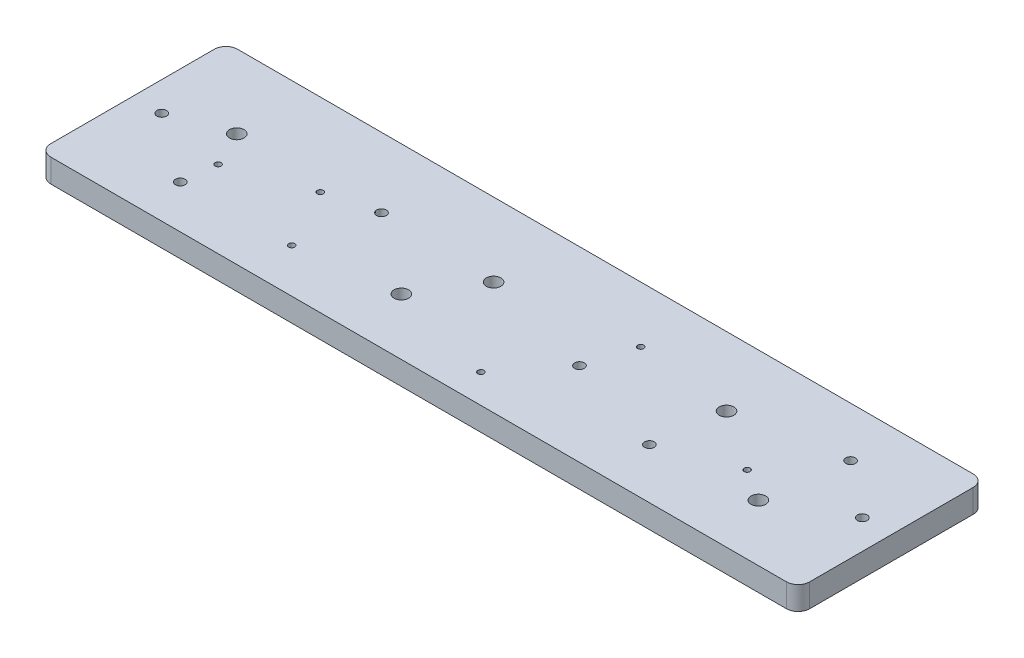
ISO-10303-21;
HEADER;
FILE_DESCRIPTION(('STEP AP214'),'2;1');
FILE_NAME('part.step','',(''),(''),'','','');
FILE_SCHEMA(('AUTOMOTIVE_DESIGN { 1 0 10303 214 1 1 1 1 }'));
ENDSEC;
DATA;
#1=APPLICATION_CONTEXT('core data for automotive mechanical design processes');
#2=APPLICATION_PROTOCOL_DEFINITION('international standard','automotive_design',2000,#1);
#3=PRODUCT_CONTEXT('',#1,'mechanical');
#4=PRODUCT('Part','Part','',(#3));
#5=PRODUCT_RELATED_PRODUCT_CATEGORY('part','',(#4));
#6=PRODUCT_DEFINITION_FORMATION('','',#4);
#7=PRODUCT_DEFINITION_CONTEXT('part definition',#1,'design');
#8=PRODUCT_DEFINITION('design','',#6,#7);
#9=PRODUCT_DEFINITION_SHAPE('','',#8);
#10=(LENGTH_UNIT() NAMED_UNIT(*) SI_UNIT(.MILLI.,.METRE.));
#11=(NAMED_UNIT(*) PLANE_ANGLE_UNIT() SI_UNIT($,.RADIAN.));
#12=(NAMED_UNIT(*) SI_UNIT($,.STERADIAN.) SOLID_ANGLE_UNIT());
#13=UNCERTAINTY_MEASURE_WITH_UNIT(LENGTH_MEASURE(1.E-05),#10,'distance_accuracy_value','');
#14=(GEOMETRIC_REPRESENTATION_CONTEXT(3) GLOBAL_UNCERTAINTY_ASSIGNED_CONTEXT((#13)) GLOBAL_UNIT_ASSIGNED_CONTEXT((#10,
#11,#12)) REPRESENTATION_CONTEXT('',''));
#15=CARTESIAN_POINT('',(0.,0.,0.));
#16=DIRECTION('',(0.,0.,1.));
#17=DIRECTION('',(1.,0.,0.));
#18=AXIS2_PLACEMENT_3D('',#15,#16,#17);
#19=CARTESIAN_POINT('',(0.,0.,0.));
#20=DIRECTION('',(0.,-1.,0.));
#21=DIRECTION('',(0.,0.,-1.));
#22=AXIS2_PLACEMENT_3D('',#19,#20,#21);
#23=PLANE('',#22);
#24=CARTESIAN_POINT('',(25.,0.,-80.));
#25=DIRECTION('',(0.,1.,0.));
#26=DIRECTION('',(0.,0.,1.));
#27=AXIS2_PLACEMENT_3D('',#24,#25,#26);
#28=CIRCLE('',#27,4.2);
#29=CARTESIAN_POINT('',(25.,0.,-75.8));
#30=VERTEX_POINT('',#29);
#31=EDGE_CURVE('E337',#30,#30,#28,.T.);
#32=ORIENTED_EDGE('',*,*,#31,.T.);
#33=EDGE_LOOP('',(#32));
#34=FACE_BOUND('',#33,.T.);
#35=CARTESIAN_POINT('',(625.,0.,-80.));
#36=DIRECTION('',(0.,1.,0.));
#37=DIRECTION('',(0.,0.,1.));
#38=AXIS2_PLACEMENT_3D('',#35,#36,#37);
#39=CIRCLE('',#38,4.19999999999998);
#40=CARTESIAN_POINT('',(625.,0.,-75.8));
#41=VERTEX_POINT('',#40);
#42=EDGE_CURVE('E329',#41,#41,#39,.T.);
#43=ORIENTED_EDGE('',*,*,#42,.T.);
#44=EDGE_LOOP('',(#43));
#45=FACE_BOUND('',#44,.T.);
#46=CARTESIAN_POINT('',(178.587076189916,0.,-37.6529586931211));
#47=DIRECTION('',(0.,1.,0.));
#48=DIRECTION('',(0.,0.,1.));
#49=AXIS2_PLACEMENT_3D('',#46,#47,#48);
#50=CIRCLE('',#49,2.59999999999999);
#51=CARTESIAN_POINT('',(178.587076189916,0.,-35.0529586931211));
#52=VERTEX_POINT('',#51);
#53=EDGE_CURVE('E321',#52,#52,#50,.T.);
#54=ORIENTED_EDGE('',*,*,#53,.T.);
#55=EDGE_LOOP('',(#54));
#56=FACE_BOUND('',#55,.T.);
#57=CARTESIAN_POINT('',(151.347462457807,0.,-89.4082247841275));
#58=DIRECTION('',(0.,1.,0.));
#59=DIRECTION('',(0.,0.,1.));
#60=AXIS2_PLACEMENT_3D('',#57,#58,#59);
#61=CIRCLE('',#60,2.59999999999999);
#62=CARTESIAN_POINT('',(151.347462457807,0.,-86.8082247841275));
#63=VERTEX_POINT('',#62);
#64=EDGE_CURVE('E313',#63,#63,#61,.T.);
#65=ORIENTED_EDGE('',*,*,#64,.T.);
#66=EDGE_LOOP('',(#65));
#67=FACE_BOUND('',#66,.T.);
#68=CARTESIAN_POINT('',(353.601594418714,0.,-24.7141421703694));
#69=DIRECTION('',(0.,1.,0.));
#70=DIRECTION('',(0.,0.,1.));
#71=AXIS2_PLACEMENT_3D('',#68,#69,#70);
#72=CIRCLE('',#71,2.59999999999999);
#73=CARTESIAN_POINT('',(353.601594418714,0.,-22.1141421703694));
#74=VERTEX_POINT('',#73);
#75=EDGE_CURVE('E305',#74,#74,#72,.T.);
#76=ORIENTED_EDGE('',*,*,#75,.T.);
#77=EDGE_LOOP('',(#76));
#78=FACE_BOUND('',#77,.T.);
#79=CARTESIAN_POINT('',(403.313889479812,0.,-111.880906113117));
#80=DIRECTION('',(0.,1.,0.));
#81=DIRECTION('',(0.,0.,1.));
#82=AXIS2_PLACEMENT_3D('',#79,#80,#81);
#83=CIRCLE('',#82,2.59999999999999);
#84=CARTESIAN_POINT('',(403.313889479812,0.,-109.280906113117));
#85=VERTEX_POINT('',#84);
#86=EDGE_CURVE('E297',#85,#85,#83,.T.);
#87=ORIENTED_EDGE('',*,*,#86,.T.);
#88=EDGE_LOOP('',(#87));
#89=FACE_BOUND('',#88,.T.);
#90=CARTESIAN_POINT('',(540.192948483658,0.,-66.2545531118351));
#91=DIRECTION('',(0.,1.,0.));
#92=DIRECTION('',(0.,0.,1.));
#93=AXIS2_PLACEMENT_3D('',#90,#91,#92);
#94=CIRCLE('',#93,2.60000000000005);
#95=CARTESIAN_POINT('',(540.192948483658,0.,-63.6545531118351));
#96=VERTEX_POINT('',#95);
#97=EDGE_CURVE('E289',#96,#96,#94,.T.);
#98=ORIENTED_EDGE('',*,*,#97,.T.);
#99=EDGE_LOOP('',(#98));
#100=FACE_BOUND('',#99,.T.);
#101=CARTESIAN_POINT('',(87.0078360424779,0.,-66.2545531118351));
#102=DIRECTION('',(0.,1.,0.));
#103=DIRECTION('',(0.,0.,1.));
#104=AXIS2_PLACEMENT_3D('',#101,#102,#103);
#105=CIRCLE('',#104,2.59999999999999);
#106=CARTESIAN_POINT('',(87.0078360424779,0.,-63.6545531118351));
#107=VERTEX_POINT('',#106);
#108=EDGE_CURVE('E281',#107,#107,#105,.T.);
#109=ORIENTED_EDGE('',*,*,#108,.T.);
#110=EDGE_LOOP('',(#109));
#111=FACE_BOUND('',#110,.T.);
#112=CARTESIAN_POINT('',(192.887873399273,0.,-100.304070276971));
#113=DIRECTION('',(0.,1.,0.));
#114=DIRECTION('',(0.,0.,1.));
#115=AXIS2_PLACEMENT_3D('',#112,#113,#114);
#116=CIRCLE('',#115,4.14999999999999);
#117=CARTESIAN_POINT('',(192.887873399273,0.,-96.154070276971));
#118=VERTEX_POINT('',#117);
#119=EDGE_CURVE('E273',#118,#118,#116,.T.);
#120=ORIENTED_EDGE('',*,*,#119,.T.);
#121=EDGE_LOOP('',(#120));
#122=FACE_BOUND('',#121,.T.);
#123=CARTESIAN_POINT('',(83.9294184708383,0.,-36.9719683498184));
#124=DIRECTION('',(0.,1.,0.));
#125=DIRECTION('',(0.,0.,1.));
#126=AXIS2_PLACEMENT_3D('',#123,#124,#125);
#127=CIRCLE('',#126,4.15);
#128=CARTESIAN_POINT('',(83.9294184708383,0.,-32.8219683498184));
#129=VERTEX_POINT('',#128);
#130=EDGE_CURVE('E265',#129,#129,#127,.T.);
#131=ORIENTED_EDGE('',*,*,#130,.T.);
#132=EDGE_LOOP('',(#131));
#133=FACE_BOUND('',#132,.T.);
#134=CARTESIAN_POINT('',(391.056063300363,0.,-71.7024758582569));
#135=DIRECTION('',(0.,1.,0.));
#136=DIRECTION('',(0.,0.,1.));
#137=AXIS2_PLACEMENT_3D('',#134,#135,#136);
#138=CIRCLE('',#137,4.14999999999999);
#139=CARTESIAN_POINT('',(391.056063300363,0.,-67.5524758582569));
#140=VERTEX_POINT('',#139);
#141=EDGE_CURVE('E257',#140,#140,#138,.T.);
#142=ORIENTED_EDGE('',*,*,#141,.T.);
#143=EDGE_LOOP('',(#142));
#144=FACE_BOUND('',#143,.T.);
#145=CARTESIAN_POINT('',(577.647417365308,0.,-117.328828859539));
#146=DIRECTION('',(0.,1.,0.));
#147=DIRECTION('',(0.,0.,1.));
#148=AXIS2_PLACEMENT_3D('',#145,#146,#147);
#149=CIRCLE('',#148,4.14999999999999);
#150=CARTESIAN_POINT('',(577.647417365308,0.,-113.178828859539));
#151=VERTEX_POINT('',#150);
#152=EDGE_CURVE('E249',#151,#151,#149,.T.);
#153=ORIENTED_EDGE('',*,*,#152,.T.);
#154=EDGE_LOOP('',(#153));
#155=FACE_BOUND('',#154,.T.);
#156=DIRECTION('',(0.,0.,-1.));
#157=VECTOR('',#156,1.);
#158=CARTESIAN_POINT('',(0.,0.,0.));
#159=LINE('',#158,#157);
#160=CARTESIAN_POINT('',(0.,0.,-10.));
#161=VERTEX_POINT('',#160);
#162=CARTESIAN_POINT('',(0.,0.,-150.));
#163=VERTEX_POINT('',#162);
#164=EDGE_CURVE('E114',#161,#163,#159,.T.);
#165=ORIENTED_EDGE('',*,*,#164,.T.);
#166=CARTESIAN_POINT('',(10.,0.,-150.));
#167=DIRECTION('',(0.,-1.,0.));
#168=DIRECTION('',(0.,0.,-1.));
#169=AXIS2_PLACEMENT_3D('',#166,#167,#168);
#170=CIRCLE('',#169,10.);
#171=CARTESIAN_POINT('',(10.,0.,-160.));
#172=VERTEX_POINT('',#171);
#173=EDGE_CURVE('E122',#163,#172,#170,.T.);
#174=ORIENTED_EDGE('',*,*,#173,.T.);
#175=DIRECTION('',(1.,0.,0.));
#176=VECTOR('',#175,1.);
#177=CARTESIAN_POINT('',(0.,0.,-160.));
#178=LINE('',#177,#176);
#179=CARTESIAN_POINT('',(640.,0.,-160.));
#180=VERTEX_POINT('',#179);
#181=EDGE_CURVE('E134',#172,#180,#178,.T.);
#182=ORIENTED_EDGE('',*,*,#181,.T.);
#183=CARTESIAN_POINT('',(640.,0.,-150.));
#184=DIRECTION('',(0.,-1.,0.));
#185=DIRECTION('',(0.,0.,-1.));
#186=AXIS2_PLACEMENT_3D('',#183,#184,#185);
#187=CIRCLE('',#186,10.);
#188=CARTESIAN_POINT('',(650.,0.,-150.));
#189=VERTEX_POINT('',#188);
#190=EDGE_CURVE('E123',#180,#189,#187,.T.);
#191=ORIENTED_EDGE('',*,*,#190,.T.);
#192=DIRECTION('',(0.,0.,-1.));
#193=VECTOR('',#192,1.);
#194=CARTESIAN_POINT('',(650.,0.,0.));
#195=LINE('',#194,#193);
#196=CARTESIAN_POINT('',(650.,0.,-10.));
#197=VERTEX_POINT('',#196);
#198=EDGE_CURVE('E185',#197,#189,#195,.T.);
#199=ORIENTED_EDGE('',*,*,#198,.F.);
#200=CARTESIAN_POINT('',(640.,0.,-10.));
#201=DIRECTION('',(0.,-1.,0.));
#202=DIRECTION('',(0.,0.,-1.));
#203=AXIS2_PLACEMENT_3D('',#200,#201,#202);
#204=CIRCLE('',#203,10.);
#205=CARTESIAN_POINT('',(640.,0.,0.));
#206=VERTEX_POINT('',#205);
#207=EDGE_CURVE('E145',#197,#206,#204,.T.);
#208=ORIENTED_EDGE('',*,*,#207,.T.);
#209=DIRECTION('',(1.,0.,0.));
#210=VECTOR('',#209,1.);
#211=CARTESIAN_POINT('',(0.,0.,0.));
#212=LINE('',#211,#210);
#213=CARTESIAN_POINT('',(10.,0.,0.));
#214=VERTEX_POINT('',#213);
#215=EDGE_CURVE('E116',#214,#206,#212,.T.);
#216=ORIENTED_EDGE('',*,*,#215,.F.);
#217=CARTESIAN_POINT('',(10.,0.,-10.));
#218=DIRECTION('',(0.,-1.,0.));
#219=DIRECTION('',(0.,0.,-1.));
#220=AXIS2_PLACEMENT_3D('',#217,#218,#219);
#221=CIRCLE('',#220,10.);
#222=EDGE_CURVE('E111',#214,#161,#221,.T.);
#223=ORIENTED_EDGE('',*,*,#222,.T.);
#224=EDGE_LOOP('',(#165,#174,#182,#191,#199,#208,#216,#223));
#225=FACE_BOUND('',#224,.T.);
#226=CARTESIAN_POINT('',(292.31246352147,0.,-96.8991185604573));
#227=DIRECTION('',(0.,1.,0.));
#228=DIRECTION('',(0.,0.,1.));
#229=AXIS2_PLACEMENT_3D('',#226,#227,#228);
#230=CIRCLE('',#229,6.24999999999998);
#231=CARTESIAN_POINT('',(292.31246352147,0.,-90.6491185604574));
#232=VERTEX_POINT('',#231);
#233=EDGE_CURVE('E135',#232,#232,#230,.T.);
#234=ORIENTED_EDGE('',*,*,#233,.T.);
#235=EDGE_LOOP('',(#234));
#236=FACE_BOUND('',#235,.T.);
#237=CARTESIAN_POINT('',(567.432562215767,0.,-48.5488041859645));
#238=DIRECTION('',(0.,1.,0.));
#239=DIRECTION('',(0.,0.,1.));
#240=AXIS2_PLACEMENT_3D('',#237,#238,#239);
#241=CIRCLE('',#240,6.24999999999998);
#242=CARTESIAN_POINT('',(567.432562215767,0.,-42.2988041859645));
#243=VERTEX_POINT('',#242);
#244=EDGE_CURVE('E209',#243,#243,#241,.T.);
#245=ORIENTED_EDGE('',*,*,#244,.T.);
#246=EDGE_LOOP('',(#245));
#247=FACE_BOUND('',#246,.T.);
#248=CARTESIAN_POINT('',(487.756692049349,0.,-100.985060620274));
#249=DIRECTION('',(0.,1.,0.));
#250=DIRECTION('',(0.,0.,1.));
#251=AXIS2_PLACEMENT_3D('',#248,#249,#250);
#252=CIRCLE('',#251,6.24999999999998);
#253=CARTESIAN_POINT('',(487.756692049349,0.,-94.7350606202737));
#254=VERTEX_POINT('',#253);
#255=EDGE_CURVE('E217',#254,#254,#252,.T.);
#256=ORIENTED_EDGE('',*,*,#255,.T.);
#257=EDGE_LOOP('',(#256));
#258=FACE_BOUND('',#257,.T.);
#259=CARTESIAN_POINT('',(261.667898072847,0.,-48.5488041859645));
#260=DIRECTION('',(0.,1.,0.));
#261=DIRECTION('',(0.,0.,1.));
#262=AXIS2_PLACEMENT_3D('',#259,#260,#261);
#263=CIRCLE('',#262,6.24999999999998);
#264=CARTESIAN_POINT('',(261.667898072847,0.,-42.2988041859645));
#265=VERTEX_POINT('',#264);
#266=EDGE_CURVE('E225',#265,#265,#263,.T.);
#267=ORIENTED_EDGE('',*,*,#266,.T.);
#268=EDGE_LOOP('',(#267));
#269=FACE_BOUND('',#268,.T.);
#270=CARTESIAN_POINT('',(72.3525826346922,0.,-96.8991185604573));
#271=DIRECTION('',(0.,1.,0.));
#272=DIRECTION('',(0.,0.,1.));
#273=AXIS2_PLACEMENT_3D('',#270,#271,#272);
#274=CIRCLE('',#273,6.24999999999999);
#275=CARTESIAN_POINT('',(72.3525826346922,0.,-90.6491185604574));
#276=VERTEX_POINT('',#275);
#277=EDGE_CURVE('E233',#276,#276,#274,.T.);
#278=ORIENTED_EDGE('',*,*,#277,.T.);
#279=EDGE_LOOP('',(#278));
#280=FACE_BOUND('',#279,.T.);
#281=CARTESIAN_POINT('',(479.584807929716,0.,-43.1008814395428));
#282=DIRECTION('',(0.,1.,0.));
#283=DIRECTION('',(0.,0.,1.));
#284=AXIS2_PLACEMENT_3D('',#281,#282,#283);
#285=CIRCLE('',#284,4.14999999999999);
#286=CARTESIAN_POINT('',(479.584807929716,0.,-38.9508814395428));
#287=VERTEX_POINT('',#286);
#288=EDGE_CURVE('E241',#287,#287,#285,.T.);
#289=ORIENTED_EDGE('',*,*,#288,.T.);
#290=EDGE_LOOP('',(#289));
#291=FACE_BOUND('',#290,.T.);
#292=ADVANCED_FACE('F45',(#34,#45,#56,#67,#78,#89,#100,#111,#122,#133,#144,#155,#225,#236,#247,
#258,#269,#280,#291),#23,.T.);
#293=CARTESIAN_POINT('',(0.,20.,0.));
#294=DIRECTION('',(-1.,0.,0.));
#295=DIRECTION('',(0.,0.,1.));
#296=AXIS2_PLACEMENT_3D('',#293,#294,#295);
#297=PLANE('',#296);
#298=DIRECTION('',(0.,0.,-1.));
#299=VECTOR('',#298,1.);
#300=CARTESIAN_POINT('',(0.,20.,0.));
#301=LINE('',#300,#299);
#302=CARTESIAN_POINT('',(0.,20.,-10.));
#303=VERTEX_POINT('',#302);
#304=CARTESIAN_POINT('',(0.,20.,-150.));
#305=VERTEX_POINT('',#304);
#306=EDGE_CURVE('E191',#303,#305,#301,.T.);
#307=ORIENTED_EDGE('',*,*,#306,.T.);
#308=DIRECTION('',(0.,-1.,0.));
#309=VECTOR('',#308,1.);
#310=CARTESIAN_POINT('',(0.,20.,-150.));
#311=LINE('',#310,#309);
#312=EDGE_CURVE('E132',#305,#163,#311,.T.);
#313=ORIENTED_EDGE('',*,*,#312,.T.);
#314=ORIENTED_EDGE('',*,*,#164,.F.);
#315=DIRECTION('',(0.,-1.,0.));
#316=VECTOR('',#315,1.);
#317=CARTESIAN_POINT('',(0.,20.,-10.));
#318=LINE('',#317,#316);
#319=EDGE_CURVE('E129',#161,#303,#318,.F.);
#320=ORIENTED_EDGE('',*,*,#319,.T.);
#321=EDGE_LOOP('',(#307,#313,#314,#320));
#322=FACE_BOUND('',#321,.T.);
#323=ADVANCED_FACE('F128',(#322),#297,.T.);
#324=CARTESIAN_POINT('',(0.,20.,0.));
#325=DIRECTION('',(0.,0.,-1.));
#326=DIRECTION('',(-1.,0.,0.));
#327=AXIS2_PLACEMENT_3D('',#324,#325,#326);
#328=PLANE('',#327);
#329=DIRECTION('',(1.,0.,0.));
#330=VECTOR('',#329,1.);
#331=CARTESIAN_POINT('',(0.,20.,0.));
#332=LINE('',#331,#330);
#333=CARTESIAN_POINT('',(10.,20.,0.));
#334=VERTEX_POINT('',#333);
#335=CARTESIAN_POINT('',(640.,20.,0.));
#336=VERTEX_POINT('',#335);
#337=EDGE_CURVE('E141',#334,#336,#332,.T.);
#338=ORIENTED_EDGE('',*,*,#337,.F.);
#339=DIRECTION('',(0.,-1.,0.));
#340=VECTOR('',#339,1.);
#341=CARTESIAN_POINT('',(10.,0.,0.));
#342=LINE('',#341,#340);
#343=EDGE_CURVE('E178',#334,#214,#342,.T.);
#344=ORIENTED_EDGE('',*,*,#343,.T.);
#345=ORIENTED_EDGE('',*,*,#215,.T.);
#346=DIRECTION('',(0.,-1.,0.));
#347=VECTOR('',#346,1.);
#348=CARTESIAN_POINT('',(640.,20.,0.));
#349=LINE('',#348,#347);
#350=EDGE_CURVE('E175',#206,#336,#349,.F.);
#351=ORIENTED_EDGE('',*,*,#350,.T.);
#352=EDGE_LOOP('',(#338,#344,#345,#351));
#353=FACE_BOUND('',#352,.T.);
#354=ADVANCED_FACE('F411',(#353),#328,.F.);
#355=CARTESIAN_POINT('',(650.,20.,0.));
#356=DIRECTION('',(-1.,0.,0.));
#357=DIRECTION('',(0.,0.,1.));
#358=AXIS2_PLACEMENT_3D('',#355,#356,#357);
#359=PLANE('',#358);
#360=ORIENTED_EDGE('',*,*,#198,.T.);
#361=DIRECTION('',(0.,-1.,0.));
#362=VECTOR('',#361,1.);
#363=CARTESIAN_POINT('',(650.,20.,-150.));
#364=LINE('',#363,#362);
#365=CARTESIAN_POINT('',(650.,20.,-150.));
#366=VERTEX_POINT('',#365);
#367=EDGE_CURVE('E11',#189,#366,#364,.F.);
#368=ORIENTED_EDGE('',*,*,#367,.T.);
#369=DIRECTION('',(0.,0.,-1.));
#370=VECTOR('',#369,1.);
#371=CARTESIAN_POINT('',(650.,20.,0.));
#372=LINE('',#371,#370);
#373=CARTESIAN_POINT('',(650.,20.,-10.));
#374=VERTEX_POINT('',#373);
#375=EDGE_CURVE('E147',#374,#366,#372,.T.);
#376=ORIENTED_EDGE('',*,*,#375,.F.);
#377=DIRECTION('',(0.,-1.,0.));
#378=VECTOR('',#377,1.);
#379=CARTESIAN_POINT('',(650.,20.,-10.));
#380=LINE('',#379,#378);
#381=EDGE_CURVE('E54',#374,#197,#380,.T.);
#382=ORIENTED_EDGE('',*,*,#381,.T.);
#383=EDGE_LOOP('',(#360,#368,#376,#382));
#384=FACE_BOUND('',#383,.T.);
#385=ADVANCED_FACE('F184',(#384),#359,.F.);
#386=CARTESIAN_POINT('',(0.,20.,-160.));
#387=DIRECTION('',(0.,0.,-1.));
#388=DIRECTION('',(-1.,0.,0.));
#389=AXIS2_PLACEMENT_3D('',#386,#387,#388);
#390=PLANE('',#389);
#391=ORIENTED_EDGE('',*,*,#181,.F.);
#392=DIRECTION('',(0.,-1.,0.));
#393=VECTOR('',#392,1.);
#394=CARTESIAN_POINT('',(10.,20.,-160.));
#395=LINE('',#394,#393);
#396=CARTESIAN_POINT('',(10.,20.,-160.));
#397=VERTEX_POINT('',#396);
#398=EDGE_CURVE('E162',#172,#397,#395,.F.);
#399=ORIENTED_EDGE('',*,*,#398,.T.);
#400=DIRECTION('',(1.,0.,0.));
#401=VECTOR('',#400,1.);
#402=CARTESIAN_POINT('',(0.,20.,-160.));
#403=LINE('',#402,#401);
#404=CARTESIAN_POINT('',(640.,20.,-160.));
#405=VERTEX_POINT('',#404);
#406=EDGE_CURVE('E196',#397,#405,#403,.T.);
#407=ORIENTED_EDGE('',*,*,#406,.T.);
#408=DIRECTION('',(0.,-1.,0.));
#409=VECTOR('',#408,1.);
#410=CARTESIAN_POINT('',(640.,0.,-160.));
#411=LINE('',#410,#409);
#412=EDGE_CURVE('E158',#405,#180,#411,.T.);
#413=ORIENTED_EDGE('',*,*,#412,.T.);
#414=EDGE_LOOP('',(#391,#399,#407,#413));
#415=FACE_BOUND('',#414,.T.);
#416=ADVANCED_FACE('F352',(#415),#390,.T.);
#417=CARTESIAN_POINT('',(0.,20.,0.));
#418=DIRECTION('',(0.,-1.,0.));
#419=DIRECTION('',(0.,0.,-1.));
#420=AXIS2_PLACEMENT_3D('',#417,#418,#419);
#421=PLANE('',#420);
#422=CARTESIAN_POINT('',(25.,20.,-80.));
#423=DIRECTION('',(0.,1.,0.));
#424=DIRECTION('',(0.,0.,1.));
#425=AXIS2_PLACEMENT_3D('',#422,#423,#424);
#426=CIRCLE('',#425,4.2);
#427=CARTESIAN_POINT('',(25.,20.,-75.8));
#428=VERTEX_POINT('',#427);
#429=EDGE_CURVE('E341',#428,#428,#426,.T.);
#430=ORIENTED_EDGE('',*,*,#429,.F.);
#431=EDGE_LOOP('',(#430));
#432=FACE_BOUND('',#431,.T.);
#433=CARTESIAN_POINT('',(625.,20.,-80.));
#434=DIRECTION('',(0.,1.,0.));
#435=DIRECTION('',(0.,0.,1.));
#436=AXIS2_PLACEMENT_3D('',#433,#434,#435);
#437=CIRCLE('',#436,4.19999999999998);
#438=CARTESIAN_POINT('',(625.,20.,-75.8));
#439=VERTEX_POINT('',#438);
#440=EDGE_CURVE('E333',#439,#439,#437,.T.);
#441=ORIENTED_EDGE('',*,*,#440,.F.);
#442=EDGE_LOOP('',(#441));
#443=FACE_BOUND('',#442,.T.);
#444=CARTESIAN_POINT('',(178.587076189916,20.,-37.6529586931211));
#445=DIRECTION('',(0.,1.,0.));
#446=DIRECTION('',(0.,0.,1.));
#447=AXIS2_PLACEMENT_3D('',#444,#445,#446);
#448=CIRCLE('',#447,2.59999999999999);
#449=CARTESIAN_POINT('',(178.587076189916,20.,-35.0529586931211));
#450=VERTEX_POINT('',#449);
#451=EDGE_CURVE('E325',#450,#450,#448,.T.);
#452=ORIENTED_EDGE('',*,*,#451,.F.);
#453=EDGE_LOOP('',(#452));
#454=FACE_BOUND('',#453,.T.);
#455=CARTESIAN_POINT('',(151.347462457807,20.,-89.4082247841275));
#456=DIRECTION('',(0.,1.,0.));
#457=DIRECTION('',(0.,0.,1.));
#458=AXIS2_PLACEMENT_3D('',#455,#456,#457);
#459=CIRCLE('',#458,2.59999999999999);
#460=CARTESIAN_POINT('',(151.347462457807,20.,-86.8082247841275));
#461=VERTEX_POINT('',#460);
#462=EDGE_CURVE('E317',#461,#461,#459,.T.);
#463=ORIENTED_EDGE('',*,*,#462,.F.);
#464=EDGE_LOOP('',(#463));
#465=FACE_BOUND('',#464,.T.);
#466=CARTESIAN_POINT('',(353.601594418714,20.,-24.7141421703694));
#467=DIRECTION('',(0.,1.,0.));
#468=DIRECTION('',(0.,0.,1.));
#469=AXIS2_PLACEMENT_3D('',#466,#467,#468);
#470=CIRCLE('',#469,2.59999999999999);
#471=CARTESIAN_POINT('',(353.601594418714,20.,-22.1141421703694));
#472=VERTEX_POINT('',#471);
#473=EDGE_CURVE('E309',#472,#472,#470,.T.);
#474=ORIENTED_EDGE('',*,*,#473,.F.);
#475=EDGE_LOOP('',(#474));
#476=FACE_BOUND('',#475,.T.);
#477=CARTESIAN_POINT('',(403.313889479812,20.,-111.880906113117));
#478=DIRECTION('',(0.,1.,0.));
#479=DIRECTION('',(0.,0.,1.));
#480=AXIS2_PLACEMENT_3D('',#477,#478,#479);
#481=CIRCLE('',#480,2.59999999999999);
#482=CARTESIAN_POINT('',(403.313889479812,20.,-109.280906113117));
#483=VERTEX_POINT('',#482);
#484=EDGE_CURVE('E301',#483,#483,#481,.T.);
#485=ORIENTED_EDGE('',*,*,#484,.F.);
#486=EDGE_LOOP('',(#485));
#487=FACE_BOUND('',#486,.T.);
#488=CARTESIAN_POINT('',(540.192948483658,20.,-66.2545531118351));
#489=DIRECTION('',(0.,1.,0.));
#490=DIRECTION('',(0.,0.,1.));
#491=AXIS2_PLACEMENT_3D('',#488,#489,#490);
#492=CIRCLE('',#491,2.60000000000005);
#493=CARTESIAN_POINT('',(540.192948483658,20.,-63.6545531118351));
#494=VERTEX_POINT('',#493);
#495=EDGE_CURVE('E293',#494,#494,#492,.T.);
#496=ORIENTED_EDGE('',*,*,#495,.F.);
#497=EDGE_LOOP('',(#496));
#498=FACE_BOUND('',#497,.T.);
#499=CARTESIAN_POINT('',(87.0078360424779,20.,-66.2545531118351));
#500=DIRECTION('',(0.,1.,0.));
#501=DIRECTION('',(0.,0.,1.));
#502=AXIS2_PLACEMENT_3D('',#499,#500,#501);
#503=CIRCLE('',#502,2.59999999999999);
#504=CARTESIAN_POINT('',(87.0078360424779,20.,-63.6545531118351));
#505=VERTEX_POINT('',#504);
#506=EDGE_CURVE('E285',#505,#505,#503,.T.);
#507=ORIENTED_EDGE('',*,*,#506,.F.);
#508=EDGE_LOOP('',(#507));
#509=FACE_BOUND('',#508,.T.);
#510=CARTESIAN_POINT('',(192.887873399273,20.,-100.304070276971));
#511=DIRECTION('',(0.,1.,0.));
#512=DIRECTION('',(0.,0.,1.));
#513=AXIS2_PLACEMENT_3D('',#510,#511,#512);
#514=CIRCLE('',#513,4.14999999999999);
#515=CARTESIAN_POINT('',(192.887873399273,20.,-96.154070276971));
#516=VERTEX_POINT('',#515);
#517=EDGE_CURVE('E277',#516,#516,#514,.T.);
#518=ORIENTED_EDGE('',*,*,#517,.F.);
#519=EDGE_LOOP('',(#518));
#520=FACE_BOUND('',#519,.T.);
#521=CARTESIAN_POINT('',(83.9294184708383,20.,-36.9719683498184));
#522=DIRECTION('',(0.,1.,0.));
#523=DIRECTION('',(0.,0.,1.));
#524=AXIS2_PLACEMENT_3D('',#521,#522,#523);
#525=CIRCLE('',#524,4.15);
#526=CARTESIAN_POINT('',(83.9294184708383,20.,-32.8219683498184));
#527=VERTEX_POINT('',#526);
#528=EDGE_CURVE('E269',#527,#527,#525,.T.);
#529=ORIENTED_EDGE('',*,*,#528,.F.);
#530=EDGE_LOOP('',(#529));
#531=FACE_BOUND('',#530,.T.);
#532=CARTESIAN_POINT('',(391.056063300363,20.,-71.7024758582569));
#533=DIRECTION('',(0.,1.,0.));
#534=DIRECTION('',(0.,0.,1.));
#535=AXIS2_PLACEMENT_3D('',#532,#533,#534);
#536=CIRCLE('',#535,4.14999999999999);
#537=CARTESIAN_POINT('',(391.056063300363,20.,-67.5524758582569));
#538=VERTEX_POINT('',#537);
#539=EDGE_CURVE('E261',#538,#538,#536,.T.);
#540=ORIENTED_EDGE('',*,*,#539,.F.);
#541=EDGE_LOOP('',(#540));
#542=FACE_BOUND('',#541,.T.);
#543=CARTESIAN_POINT('',(577.647417365308,20.,-117.328828859539));
#544=DIRECTION('',(0.,1.,0.));
#545=DIRECTION('',(0.,0.,1.));
#546=AXIS2_PLACEMENT_3D('',#543,#544,#545);
#547=CIRCLE('',#546,4.14999999999999);
#548=CARTESIAN_POINT('',(577.647417365308,20.,-113.178828859539));
#549=VERTEX_POINT('',#548);
#550=EDGE_CURVE('E253',#549,#549,#547,.T.);
#551=ORIENTED_EDGE('',*,*,#550,.F.);
#552=EDGE_LOOP('',(#551));
#553=FACE_BOUND('',#552,.T.);
#554=CARTESIAN_POINT('',(479.584807929716,20.,-43.1008814395428));
#555=DIRECTION('',(0.,1.,0.));
#556=DIRECTION('',(0.,0.,1.));
#557=AXIS2_PLACEMENT_3D('',#554,#555,#556);
#558=CIRCLE('',#557,4.14999999999999);
#559=CARTESIAN_POINT('',(479.584807929716,20.,-38.9508814395428));
#560=VERTEX_POINT('',#559);
#561=EDGE_CURVE('E245',#560,#560,#558,.T.);
#562=ORIENTED_EDGE('',*,*,#561,.F.);
#563=EDGE_LOOP('',(#562));
#564=FACE_BOUND('',#563,.T.);
#565=CARTESIAN_POINT('',(72.3525826346922,20.,-96.8991185604573));
#566=DIRECTION('',(0.,1.,0.));
#567=DIRECTION('',(0.,0.,1.));
#568=AXIS2_PLACEMENT_3D('',#565,#566,#567);
#569=CIRCLE('',#568,6.24999999999999);
#570=CARTESIAN_POINT('',(72.3525826346922,20.,-90.6491185604574));
#571=VERTEX_POINT('',#570);
#572=EDGE_CURVE('E237',#571,#571,#569,.T.);
#573=ORIENTED_EDGE('',*,*,#572,.F.);
#574=EDGE_LOOP('',(#573));
#575=FACE_BOUND('',#574,.T.);
#576=CARTESIAN_POINT('',(261.667898072847,20.,-48.5488041859645));
#577=DIRECTION('',(0.,1.,0.));
#578=DIRECTION('',(0.,0.,1.));
#579=AXIS2_PLACEMENT_3D('',#576,#577,#578);
#580=CIRCLE('',#579,6.24999999999998);
#581=CARTESIAN_POINT('',(261.667898072847,20.,-42.2988041859645));
#582=VERTEX_POINT('',#581);
#583=EDGE_CURVE('E229',#582,#582,#580,.T.);
#584=ORIENTED_EDGE('',*,*,#583,.F.);
#585=EDGE_LOOP('',(#584));
#586=FACE_BOUND('',#585,.T.);
#587=CARTESIAN_POINT('',(487.756692049349,20.,-100.985060620274));
#588=DIRECTION('',(0.,1.,0.));
#589=DIRECTION('',(0.,0.,1.));
#590=AXIS2_PLACEMENT_3D('',#587,#588,#589);
#591=CIRCLE('',#590,6.24999999999998);
#592=CARTESIAN_POINT('',(487.756692049349,20.,-94.7350606202737));
#593=VERTEX_POINT('',#592);
#594=EDGE_CURVE('E221',#593,#593,#591,.T.);
#595=ORIENTED_EDGE('',*,*,#594,.F.);
#596=EDGE_LOOP('',(#595));
#597=FACE_BOUND('',#596,.T.);
#598=CARTESIAN_POINT('',(567.432562215767,20.,-48.5488041859645));
#599=DIRECTION('',(0.,1.,0.));
#600=DIRECTION('',(0.,0.,1.));
#601=AXIS2_PLACEMENT_3D('',#598,#599,#600);
#602=CIRCLE('',#601,6.24999999999998);
#603=CARTESIAN_POINT('',(567.432562215767,20.,-42.2988041859645));
#604=VERTEX_POINT('',#603);
#605=EDGE_CURVE('E213',#604,#604,#602,.T.);
#606=ORIENTED_EDGE('',*,*,#605,.F.);
#607=EDGE_LOOP('',(#606));
#608=FACE_BOUND('',#607,.T.);
#609=CARTESIAN_POINT('',(292.31246352147,20.,-96.8991185604573));
#610=DIRECTION('',(0.,1.,0.));
#611=DIRECTION('',(0.,0.,1.));
#612=AXIS2_PLACEMENT_3D('',#609,#610,#611);
#613=CIRCLE('',#612,6.24999999999998);
#614=CARTESIAN_POINT('',(292.31246352147,20.,-90.6491185604574));
#615=VERTEX_POINT('',#614);
#616=EDGE_CURVE('E205',#615,#615,#613,.T.);
#617=ORIENTED_EDGE('',*,*,#616,.F.);
#618=EDGE_LOOP('',(#617));
#619=FACE_BOUND('',#618,.T.);
#620=ORIENTED_EDGE('',*,*,#406,.F.);
#621=CARTESIAN_POINT('',(10.,20.,-150.));
#622=DIRECTION('',(0.,-1.,0.));
#623=DIRECTION('',(0.,0.,-1.));
#624=AXIS2_PLACEMENT_3D('',#621,#622,#623);
#625=CIRCLE('',#624,10.);
#626=EDGE_CURVE('E172',#397,#305,#625,.F.);
#627=ORIENTED_EDGE('',*,*,#626,.T.);
#628=ORIENTED_EDGE('',*,*,#306,.F.);
#629=CARTESIAN_POINT('',(10.,20.,-10.));
#630=DIRECTION('',(0.,-1.,0.));
#631=DIRECTION('',(0.,0.,-1.));
#632=AXIS2_PLACEMENT_3D('',#629,#630,#631);
#633=CIRCLE('',#632,10.);
#634=EDGE_CURVE('E139',#303,#334,#633,.F.);
#635=ORIENTED_EDGE('',*,*,#634,.T.);
#636=ORIENTED_EDGE('',*,*,#337,.T.);
#637=CARTESIAN_POINT('',(640.,20.,-10.));
#638=DIRECTION('',(0.,-1.,0.));
#639=DIRECTION('',(0.,0.,-1.));
#640=AXIS2_PLACEMENT_3D('',#637,#638,#639);
#641=CIRCLE('',#640,10.);
#642=EDGE_CURVE('E66',#336,#374,#641,.F.);
#643=ORIENTED_EDGE('',*,*,#642,.T.);
#644=ORIENTED_EDGE('',*,*,#375,.T.);
#645=CARTESIAN_POINT('',(640.,20.,-150.));
#646=DIRECTION('',(0.,-1.,0.));
#647=DIRECTION('',(0.,0.,-1.));
#648=AXIS2_PLACEMENT_3D('',#645,#646,#647);
#649=CIRCLE('',#648,10.);
#650=EDGE_CURVE('E167',#366,#405,#649,.F.);
#651=ORIENTED_EDGE('',*,*,#650,.T.);
#652=EDGE_LOOP('',(#620,#627,#628,#635,#636,#643,#644,#651));
#653=FACE_BOUND('',#652,.T.);
#654=ADVANCED_FACE('F348',(#432,#443,#454,#465,#476,#487,#498,#509,#520,#531,#542,#553,#564,
#575,#586,#597,#608,#619,#653),#421,.F.);
#655=CARTESIAN_POINT('',(10.,20.,-150.));
#656=DIRECTION('',(0.,-1.,0.));
#657=DIRECTION('',(0.,0.,-1.));
#658=AXIS2_PLACEMENT_3D('',#655,#656,#657);
#659=CYLINDRICAL_SURFACE('',#658,10.);
#660=ORIENTED_EDGE('',*,*,#626,.F.);
#661=ORIENTED_EDGE('',*,*,#398,.F.);
#662=ORIENTED_EDGE('',*,*,#173,.F.);
#663=ORIENTED_EDGE('',*,*,#312,.F.);
#664=EDGE_LOOP('',(#660,#661,#662,#663));
#665=FACE_BOUND('',#664,.T.);
#666=ADVANCED_FACE('F351',(#665),#659,.T.);
#667=CARTESIAN_POINT('',(10.,20.,-10.));
#668=DIRECTION('',(0.,1.,0.));
#669=DIRECTION('',(0.,0.,1.));
#670=AXIS2_PLACEMENT_3D('',#667,#668,#669);
#671=CYLINDRICAL_SURFACE('',#670,10.);
#672=ORIENTED_EDGE('',*,*,#634,.F.);
#673=ORIENTED_EDGE('',*,*,#319,.F.);
#674=ORIENTED_EDGE('',*,*,#222,.F.);
#675=ORIENTED_EDGE('',*,*,#343,.F.);
#676=EDGE_LOOP('',(#672,#673,#674,#675));
#677=FACE_BOUND('',#676,.T.);
#678=ADVANCED_FACE('F138',(#677),#671,.T.);
#679=CARTESIAN_POINT('',(640.,20.,-150.));
#680=DIRECTION('',(0.,1.,0.));
#681=DIRECTION('',(0.,0.,1.));
#682=AXIS2_PLACEMENT_3D('',#679,#680,#681);
#683=CYLINDRICAL_SURFACE('',#682,10.);
#684=ORIENTED_EDGE('',*,*,#650,.F.);
#685=ORIENTED_EDGE('',*,*,#367,.F.);
#686=ORIENTED_EDGE('',*,*,#190,.F.);
#687=ORIENTED_EDGE('',*,*,#412,.F.);
#688=EDGE_LOOP('',(#684,#685,#686,#687));
#689=FACE_BOUND('',#688,.T.);
#690=ADVANCED_FACE('F396',(#689),#683,.T.);
#691=CARTESIAN_POINT('',(640.,20.,-10.));
#692=DIRECTION('',(0.,-1.,0.));
#693=DIRECTION('',(0.,0.,-1.));
#694=AXIS2_PLACEMENT_3D('',#691,#692,#693);
#695=CYLINDRICAL_SURFACE('',#694,10.);
#696=ORIENTED_EDGE('',*,*,#642,.F.);
#697=ORIENTED_EDGE('',*,*,#350,.F.);
#698=ORIENTED_EDGE('',*,*,#207,.F.);
#699=ORIENTED_EDGE('',*,*,#381,.F.);
#700=EDGE_LOOP('',(#696,#697,#698,#699));
#701=FACE_BOUND('',#700,.T.);
#702=ADVANCED_FACE('F47',(#701),#695,.T.);
#703=CARTESIAN_POINT('',(292.31246352147,20.,-96.8991185604573));
#704=DIRECTION('',(0.,1.,0.));
#705=DIRECTION('',(0.,0.,1.));
#706=AXIS2_PLACEMENT_3D('',#703,#704,#705);
#707=CYLINDRICAL_SURFACE('',#706,6.24999999999998);
#708=ORIENTED_EDGE('',*,*,#233,.F.);
#709=EDGE_LOOP('',(#708));
#710=FACE_BOUND('',#709,.T.);
#711=ORIENTED_EDGE('',*,*,#616,.T.);
#712=EDGE_LOOP('',(#711));
#713=FACE_BOUND('',#712,.T.);
#714=ADVANCED_FACE('F402',(#710,#713),#707,.F.);
#715=CARTESIAN_POINT('',(567.432562215767,20.,-48.5488041859645));
#716=DIRECTION('',(0.,1.,0.));
#717=DIRECTION('',(0.,0.,1.));
#718=AXIS2_PLACEMENT_3D('',#715,#716,#717);
#719=CYLINDRICAL_SURFACE('',#718,6.24999999999998);
#720=ORIENTED_EDGE('',*,*,#244,.F.);
#721=EDGE_LOOP('',(#720));
#722=FACE_BOUND('',#721,.T.);
#723=ORIENTED_EDGE('',*,*,#605,.T.);
#724=EDGE_LOOP('',(#723));
#725=FACE_BOUND('',#724,.T.);
#726=ADVANCED_FACE('F454',(#722,#725),#719,.F.);
#727=CARTESIAN_POINT('',(487.756692049349,20.,-100.985060620274));
#728=DIRECTION('',(0.,1.,0.));
#729=DIRECTION('',(0.,0.,1.));
#730=AXIS2_PLACEMENT_3D('',#727,#728,#729);
#731=CYLINDRICAL_SURFACE('',#730,6.24999999999998);
#732=ORIENTED_EDGE('',*,*,#255,.F.);
#733=EDGE_LOOP('',(#732));
#734=FACE_BOUND('',#733,.T.);
#735=ORIENTED_EDGE('',*,*,#594,.T.);
#736=EDGE_LOOP('',(#735));
#737=FACE_BOUND('',#736,.T.);
#738=ADVANCED_FACE('F463',(#734,#737),#731,.F.);
#739=CARTESIAN_POINT('',(261.667898072847,20.,-48.5488041859645));
#740=DIRECTION('',(0.,1.,0.));
#741=DIRECTION('',(0.,0.,1.));
#742=AXIS2_PLACEMENT_3D('',#739,#740,#741);
#743=CYLINDRICAL_SURFACE('',#742,6.24999999999998);
#744=ORIENTED_EDGE('',*,*,#266,.F.);
#745=EDGE_LOOP('',(#744));
#746=FACE_BOUND('',#745,.T.);
#747=ORIENTED_EDGE('',*,*,#583,.T.);
#748=EDGE_LOOP('',(#747));
#749=FACE_BOUND('',#748,.T.);
#750=ADVANCED_FACE('F473',(#746,#749),#743,.F.);
#751=CARTESIAN_POINT('',(72.3525826346922,20.,-96.8991185604573));
#752=DIRECTION('',(0.,1.,0.));
#753=DIRECTION('',(0.,0.,1.));
#754=AXIS2_PLACEMENT_3D('',#751,#752,#753);
#755=CYLINDRICAL_SURFACE('',#754,6.24999999999999);
#756=ORIENTED_EDGE('',*,*,#277,.F.);
#757=EDGE_LOOP('',(#756));
#758=FACE_BOUND('',#757,.T.);
#759=ORIENTED_EDGE('',*,*,#572,.T.);
#760=EDGE_LOOP('',(#759));
#761=FACE_BOUND('',#760,.T.);
#762=ADVANCED_FACE('F483',(#758,#761),#755,.F.);
#763=CARTESIAN_POINT('',(479.584807929716,20.,-43.1008814395428));
#764=DIRECTION('',(0.,1.,0.));
#765=DIRECTION('',(0.,0.,1.));
#766=AXIS2_PLACEMENT_3D('',#763,#764,#765);
#767=CYLINDRICAL_SURFACE('',#766,4.14999999999999);
#768=ORIENTED_EDGE('',*,*,#288,.F.);
#769=EDGE_LOOP('',(#768));
#770=FACE_BOUND('',#769,.T.);
#771=ORIENTED_EDGE('',*,*,#561,.T.);
#772=EDGE_LOOP('',(#771));
#773=FACE_BOUND('',#772,.T.);
#774=ADVANCED_FACE('F493',(#770,#773),#767,.F.);
#775=CARTESIAN_POINT('',(577.647417365308,20.,-117.328828859539));
#776=DIRECTION('',(0.,1.,0.));
#777=DIRECTION('',(0.,0.,1.));
#778=AXIS2_PLACEMENT_3D('',#775,#776,#777);
#779=CYLINDRICAL_SURFACE('',#778,4.14999999999999);
#780=ORIENTED_EDGE('',*,*,#152,.F.);
#781=EDGE_LOOP('',(#780));
#782=FACE_BOUND('',#781,.T.);
#783=ORIENTED_EDGE('',*,*,#550,.T.);
#784=EDGE_LOOP('',(#783));
#785=FACE_BOUND('',#784,.T.);
#786=ADVANCED_FACE('F507',(#782,#785),#779,.F.);
#787=CARTESIAN_POINT('',(391.056063300363,20.,-71.7024758582569));
#788=DIRECTION('',(0.,1.,0.));
#789=DIRECTION('',(0.,0.,1.));
#790=AXIS2_PLACEMENT_3D('',#787,#788,#789);
#791=CYLINDRICAL_SURFACE('',#790,4.14999999999999);
#792=ORIENTED_EDGE('',*,*,#141,.F.);
#793=EDGE_LOOP('',(#792));
#794=FACE_BOUND('',#793,.T.);
#795=ORIENTED_EDGE('',*,*,#539,.T.);
#796=EDGE_LOOP('',(#795));
#797=FACE_BOUND('',#796,.T.);
#798=ADVANCED_FACE('F517',(#794,#797),#791,.F.);
#799=CARTESIAN_POINT('',(83.9294184708383,20.,-36.9719683498184));
#800=DIRECTION('',(0.,1.,0.));
#801=DIRECTION('',(0.,0.,1.));
#802=AXIS2_PLACEMENT_3D('',#799,#800,#801);
#803=CYLINDRICAL_SURFACE('',#802,4.15);
#804=ORIENTED_EDGE('',*,*,#130,.F.);
#805=EDGE_LOOP('',(#804));
#806=FACE_BOUND('',#805,.T.);
#807=ORIENTED_EDGE('',*,*,#528,.T.);
#808=EDGE_LOOP('',(#807));
#809=FACE_BOUND('',#808,.T.);
#810=ADVANCED_FACE('F527',(#806,#809),#803,.F.);
#811=CARTESIAN_POINT('',(192.887873399273,20.,-100.304070276971));
#812=DIRECTION('',(0.,1.,0.));
#813=DIRECTION('',(0.,0.,1.));
#814=AXIS2_PLACEMENT_3D('',#811,#812,#813);
#815=CYLINDRICAL_SURFACE('',#814,4.14999999999999);
#816=ORIENTED_EDGE('',*,*,#119,.F.);
#817=EDGE_LOOP('',(#816));
#818=FACE_BOUND('',#817,.T.);
#819=ORIENTED_EDGE('',*,*,#517,.T.);
#820=EDGE_LOOP('',(#819));
#821=FACE_BOUND('',#820,.T.);
#822=ADVANCED_FACE('F537',(#818,#821),#815,.F.);
#823=CARTESIAN_POINT('',(87.0078360424779,20.,-66.2545531118351));
#824=DIRECTION('',(0.,1.,0.));
#825=DIRECTION('',(0.,0.,1.));
#826=AXIS2_PLACEMENT_3D('',#823,#824,#825);
#827=CYLINDRICAL_SURFACE('',#826,2.59999999999999);
#828=ORIENTED_EDGE('',*,*,#108,.F.);
#829=EDGE_LOOP('',(#828));
#830=FACE_BOUND('',#829,.T.);
#831=ORIENTED_EDGE('',*,*,#506,.T.);
#832=EDGE_LOOP('',(#831));
#833=FACE_BOUND('',#832,.T.);
#834=ADVANCED_FACE('F547',(#830,#833),#827,.F.);
#835=CARTESIAN_POINT('',(540.192948483658,20.,-66.2545531118351));
#836=DIRECTION('',(0.,1.,0.));
#837=DIRECTION('',(0.,0.,1.));
#838=AXIS2_PLACEMENT_3D('',#835,#836,#837);
#839=CYLINDRICAL_SURFACE('',#838,2.60000000000005);
#840=ORIENTED_EDGE('',*,*,#97,.F.);
#841=EDGE_LOOP('',(#840));
#842=FACE_BOUND('',#841,.T.);
#843=ORIENTED_EDGE('',*,*,#495,.T.);
#844=EDGE_LOOP('',(#843));
#845=FACE_BOUND('',#844,.T.);
#846=ADVANCED_FACE('F557',(#842,#845),#839,.F.);
#847=CARTESIAN_POINT('',(403.313889479812,20.,-111.880906113117));
#848=DIRECTION('',(0.,1.,0.));
#849=DIRECTION('',(0.,0.,1.));
#850=AXIS2_PLACEMENT_3D('',#847,#848,#849);
#851=CYLINDRICAL_SURFACE('',#850,2.59999999999999);
#852=ORIENTED_EDGE('',*,*,#86,.F.);
#853=EDGE_LOOP('',(#852));
#854=FACE_BOUND('',#853,.T.);
#855=ORIENTED_EDGE('',*,*,#484,.T.);
#856=EDGE_LOOP('',(#855));
#857=FACE_BOUND('',#856,.T.);
#858=ADVANCED_FACE('F567',(#854,#857),#851,.F.);
#859=CARTESIAN_POINT('',(353.601594418714,20.,-24.7141421703694));
#860=DIRECTION('',(0.,1.,0.));
#861=DIRECTION('',(0.,0.,1.));
#862=AXIS2_PLACEMENT_3D('',#859,#860,#861);
#863=CYLINDRICAL_SURFACE('',#862,2.59999999999999);
#864=ORIENTED_EDGE('',*,*,#75,.F.);
#865=EDGE_LOOP('',(#864));
#866=FACE_BOUND('',#865,.T.);
#867=ORIENTED_EDGE('',*,*,#473,.T.);
#868=EDGE_LOOP('',(#867));
#869=FACE_BOUND('',#868,.T.);
#870=ADVANCED_FACE('F577',(#866,#869),#863,.F.);
#871=CARTESIAN_POINT('',(151.347462457807,20.,-89.4082247841275));
#872=DIRECTION('',(0.,1.,0.));
#873=DIRECTION('',(0.,0.,1.));
#874=AXIS2_PLACEMENT_3D('',#871,#872,#873);
#875=CYLINDRICAL_SURFACE('',#874,2.59999999999999);
#876=ORIENTED_EDGE('',*,*,#64,.F.);
#877=EDGE_LOOP('',(#876));
#878=FACE_BOUND('',#877,.T.);
#879=ORIENTED_EDGE('',*,*,#462,.T.);
#880=EDGE_LOOP('',(#879));
#881=FACE_BOUND('',#880,.T.);
#882=ADVANCED_FACE('F587',(#878,#881),#875,.F.);
#883=CARTESIAN_POINT('',(178.587076189916,20.,-37.6529586931211));
#884=DIRECTION('',(0.,1.,0.));
#885=DIRECTION('',(0.,0.,1.));
#886=AXIS2_PLACEMENT_3D('',#883,#884,#885);
#887=CYLINDRICAL_SURFACE('',#886,2.59999999999999);
#888=ORIENTED_EDGE('',*,*,#53,.F.);
#889=EDGE_LOOP('',(#888));
#890=FACE_BOUND('',#889,.T.);
#891=ORIENTED_EDGE('',*,*,#451,.T.);
#892=EDGE_LOOP('',(#891));
#893=FACE_BOUND('',#892,.T.);
#894=ADVANCED_FACE('F597',(#890,#893),#887,.F.);
#895=CARTESIAN_POINT('',(625.,20.,-80.));
#896=DIRECTION('',(0.,1.,0.));
#897=DIRECTION('',(0.,0.,1.));
#898=AXIS2_PLACEMENT_3D('',#895,#896,#897);
#899=CYLINDRICAL_SURFACE('',#898,4.19999999999998);
#900=ORIENTED_EDGE('',*,*,#42,.F.);
#901=EDGE_LOOP('',(#900));
#902=FACE_BOUND('',#901,.T.);
#903=ORIENTED_EDGE('',*,*,#440,.T.);
#904=EDGE_LOOP('',(#903));
#905=FACE_BOUND('',#904,.T.);
#906=ADVANCED_FACE('F606',(#902,#905),#899,.F.);
#907=CARTESIAN_POINT('',(25.,20.,-80.));
#908=DIRECTION('',(0.,1.,0.));
#909=DIRECTION('',(0.,0.,1.));
#910=AXIS2_PLACEMENT_3D('',#907,#908,#909);
#911=CYLINDRICAL_SURFACE('',#910,4.2);
#912=ORIENTED_EDGE('',*,*,#31,.F.);
#913=EDGE_LOOP('',(#912));
#914=FACE_BOUND('',#913,.T.);
#915=ORIENTED_EDGE('',*,*,#429,.T.);
#916=EDGE_LOOP('',(#915));
#917=FACE_BOUND('',#916,.T.);
#918=ADVANCED_FACE('F346',(#914,#917),#911,.F.);
#919=CLOSED_SHELL('',(#292,#323,#354,#385,#416,#654,#666,#678,#690,#702,#714,#726,#738,#750,
#762,#774,#786,#798,#810,#822,#834,#846,#858,#870,#882,#894,#906,#918));
#920=MANIFOLD_SOLID_BREP('B2',#919);
#921=ADVANCED_BREP_SHAPE_REPRESENTATION('',(#18,#920),#14);
#922=SHAPE_DEFINITION_REPRESENTATION(#9,#921);
ENDSEC;
END-ISO-10303-21;
